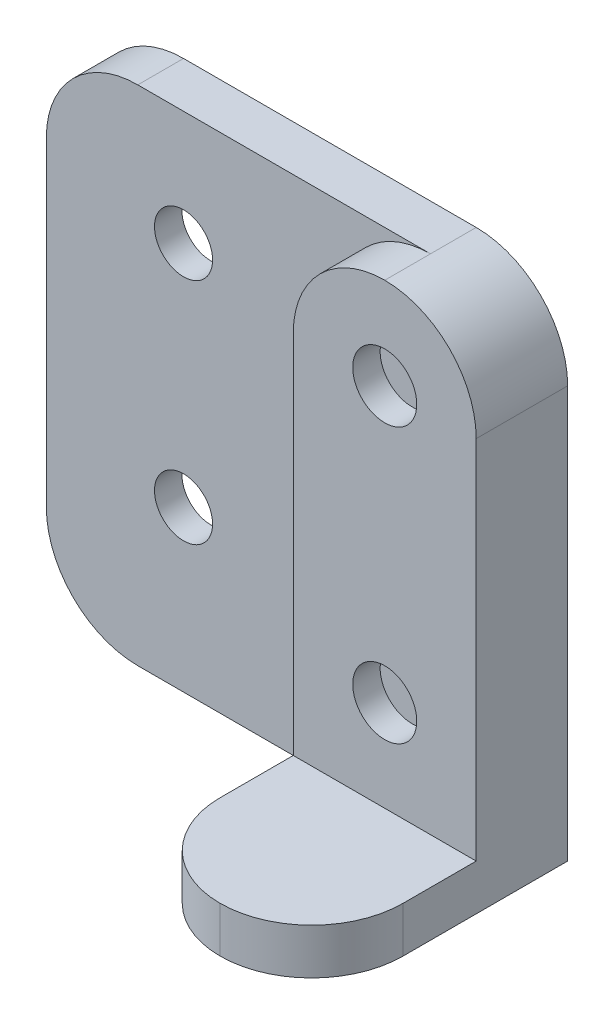
ISO-10303-21;
HEADER;
FILE_DESCRIPTION(('STEP AP214'),'2;1');
FILE_NAME('part.step','',(''),(''),'','','');
FILE_SCHEMA(('AUTOMOTIVE_DESIGN { 1 0 10303 214 1 1 1 1 }'));
ENDSEC;
DATA;
#1=APPLICATION_CONTEXT('core data for automotive mechanical design processes');
#2=APPLICATION_PROTOCOL_DEFINITION('international standard','automotive_design',2000,#1);
#3=PRODUCT_CONTEXT('',#1,'mechanical');
#4=PRODUCT('Part','Part','',(#3));
#5=PRODUCT_RELATED_PRODUCT_CATEGORY('part','',(#4));
#6=PRODUCT_DEFINITION_FORMATION('','',#4);
#7=PRODUCT_DEFINITION_CONTEXT('part definition',#1,'design');
#8=PRODUCT_DEFINITION('design','',#6,#7);
#9=PRODUCT_DEFINITION_SHAPE('','',#8);
#10=(LENGTH_UNIT() NAMED_UNIT(*) SI_UNIT(.MILLI.,.METRE.));
#11=(NAMED_UNIT(*) PLANE_ANGLE_UNIT() SI_UNIT($,.RADIAN.));
#12=(NAMED_UNIT(*) SI_UNIT($,.STERADIAN.) SOLID_ANGLE_UNIT());
#13=UNCERTAINTY_MEASURE_WITH_UNIT(LENGTH_MEASURE(1.E-05),#10,'distance_accuracy_value','');
#14=(GEOMETRIC_REPRESENTATION_CONTEXT(3) GLOBAL_UNCERTAINTY_ASSIGNED_CONTEXT((#13)) GLOBAL_UNIT_ASSIGNED_CONTEXT((#10,
#11,#12)) REPRESENTATION_CONTEXT('',''));
#15=CARTESIAN_POINT('',(0.,0.,0.));
#16=DIRECTION('',(0.,0.,1.));
#17=DIRECTION('',(1.,0.,0.));
#18=AXIS2_PLACEMENT_3D('',#15,#16,#17);
#19=CARTESIAN_POINT('',(0.,-12.5,0.));
#20=DIRECTION('',(0.,0.,1.));
#21=DIRECTION('',(1.,0.,0.));
#22=AXIS2_PLACEMENT_3D('',#19,#20,#21);
#23=CYLINDRICAL_SURFACE('',#22,3.175);
#24=CARTESIAN_POINT('',(0.,-12.5,5.));
#25=DIRECTION('',(0.,0.,1.));
#26=DIRECTION('',(1.,0.,0.));
#27=AXIS2_PLACEMENT_3D('',#24,#25,#26);
#28=CIRCLE('',#27,3.175);
#29=CARTESIAN_POINT('',(3.175,-12.5,5.));
#30=VERTEX_POINT('',#29);
#31=EDGE_CURVE('E198',#30,#30,#28,.T.);
#32=ORIENTED_EDGE('',*,*,#31,.T.);
#33=EDGE_LOOP('',(#32));
#34=FACE_BOUND('',#33,.T.);
#35=CARTESIAN_POINT('',(0.,-12.5,2.));
#36=DIRECTION('',(0.,0.,-1.));
#37=DIRECTION('',(-1.,0.,0.));
#38=AXIS2_PLACEMENT_3D('',#35,#36,#37);
#39=CIRCLE('',#38,3.175);
#40=CARTESIAN_POINT('',(-3.175,-12.5,2.));
#41=VERTEX_POINT('',#40);
#42=EDGE_CURVE('E189',#41,#41,#39,.F.);
#43=ORIENTED_EDGE('',*,*,#42,.F.);
#44=EDGE_LOOP('',(#43));
#45=FACE_BOUND('',#44,.T.);
#46=ADVANCED_FACE('F35',(#34,#45),#23,.F.);
#47=CARTESIAN_POINT('',(0.,12.5,0.));
#48=DIRECTION('',(0.,0.,1.));
#49=DIRECTION('',(1.,0.,0.));
#50=AXIS2_PLACEMENT_3D('',#47,#48,#49);
#51=CYLINDRICAL_SURFACE('',#50,3.175);
#52=CARTESIAN_POINT('',(0.,12.5,5.));
#53=DIRECTION('',(0.,0.,1.));
#54=DIRECTION('',(1.,0.,0.));
#55=AXIS2_PLACEMENT_3D('',#52,#53,#54);
#56=CIRCLE('',#55,3.175);
#57=CARTESIAN_POINT('',(3.17499999999999,12.5,5.));
#58=VERTEX_POINT('',#57);
#59=EDGE_CURVE('E199',#58,#58,#56,.T.);
#60=ORIENTED_EDGE('',*,*,#59,.T.);
#61=EDGE_LOOP('',(#60));
#62=FACE_BOUND('',#61,.T.);
#63=CARTESIAN_POINT('',(0.,12.5,2.));
#64=DIRECTION('',(0.,0.,-1.));
#65=DIRECTION('',(-1.,0.,0.));
#66=AXIS2_PLACEMENT_3D('',#63,#64,#65);
#67=CIRCLE('',#66,3.175);
#68=CARTESIAN_POINT('',(-3.175,12.5,2.));
#69=VERTEX_POINT('',#68);
#70=EDGE_CURVE('E169',#69,#69,#67,.F.);
#71=ORIENTED_EDGE('',*,*,#70,.F.);
#72=EDGE_LOOP('',(#71));
#73=FACE_BOUND('',#72,.T.);
#74=ADVANCED_FACE('F315',(#62,#73),#51,.F.);
#75=CARTESIAN_POINT('',(-15.,25.,5.));
#76=DIRECTION('',(0.,-1.,0.));
#77=DIRECTION('',(0.,0.,-1.));
#78=AXIS2_PLACEMENT_3D('',#75,#76,#77);
#79=PLANE('',#78);
#80=DIRECTION('',(-1.,0.,0.));
#81=VECTOR('',#80,1.);
#82=CARTESIAN_POINT('',(-15.,25.,0.));
#83=LINE('',#82,#81);
#84=CARTESIAN_POINT('',(27.,25.,0.));
#85=VERTEX_POINT('',#84);
#86=CARTESIAN_POINT('',(-5.,25.,0.));
#87=VERTEX_POINT('',#86);
#88=EDGE_CURVE('E202',#85,#87,#83,.T.);
#89=ORIENTED_EDGE('',*,*,#88,.T.);
#90=DIRECTION('',(0.,0.,-1.));
#91=VECTOR('',#90,1.);
#92=CARTESIAN_POINT('',(-5.,25.,5.));
#93=LINE('',#92,#91);
#94=CARTESIAN_POINT('',(-5.,25.,5.));
#95=VERTEX_POINT('',#94);
#96=EDGE_CURVE('E232',#87,#95,#93,.F.);
#97=ORIENTED_EDGE('',*,*,#96,.T.);
#98=DIRECTION('',(-1.,0.,0.));
#99=VECTOR('',#98,1.);
#100=CARTESIAN_POINT('',(-15.,25.,5.));
#101=LINE('',#100,#99);
#102=CARTESIAN_POINT('',(27.,25.,5.));
#103=VERTEX_POINT('',#102);
#104=EDGE_CURVE('E205',#103,#95,#101,.T.);
#105=ORIENTED_EDGE('',*,*,#104,.F.);
#106=DIRECTION('',(0.,0.,1.));
#107=VECTOR('',#106,1.);
#108=CARTESIAN_POINT('',(27.,25.,5.));
#109=LINE('',#108,#107);
#110=EDGE_CURVE('E230',#103,#85,#109,.F.);
#111=ORIENTED_EDGE('',*,*,#110,.T.);
#112=EDGE_LOOP('',(#89,#97,#105,#111));
#113=FACE_BOUND('',#112,.T.);
#114=ADVANCED_FACE('F292',(#113),#79,.F.);
#115=CARTESIAN_POINT('',(-15.,-25.,5.));
#116=DIRECTION('',(1.,0.,0.));
#117=DIRECTION('',(0.,0.,-1.));
#118=AXIS2_PLACEMENT_3D('',#115,#116,#117);
#119=PLANE('',#118);
#120=DIRECTION('',(0.,-1.,0.));
#121=VECTOR('',#120,1.);
#122=CARTESIAN_POINT('',(-15.,-25.,0.));
#123=LINE('',#122,#121);
#124=CARTESIAN_POINT('',(-15.,15.,0.));
#125=VERTEX_POINT('',#124);
#126=CARTESIAN_POINT('',(-15.,-20.,0.));
#127=VERTEX_POINT('',#126);
#128=EDGE_CURVE('E209',#125,#127,#123,.T.);
#129=ORIENTED_EDGE('',*,*,#128,.T.);
#130=DIRECTION('',(0.,0.,-1.));
#131=VECTOR('',#130,1.);
#132=CARTESIAN_POINT('',(-15.,-20.,5.));
#133=LINE('',#132,#131);
#134=CARTESIAN_POINT('',(-15.,-20.,5.));
#135=VERTEX_POINT('',#134);
#136=EDGE_CURVE('E247',#127,#135,#133,.F.);
#137=ORIENTED_EDGE('',*,*,#136,.T.);
#138=DIRECTION('',(0.,-1.,0.));
#139=VECTOR('',#138,1.);
#140=CARTESIAN_POINT('',(-15.,-25.,5.));
#141=LINE('',#140,#139);
#142=CARTESIAN_POINT('',(-15.,15.,5.));
#143=VERTEX_POINT('',#142);
#144=EDGE_CURVE('E208',#143,#135,#141,.T.);
#145=ORIENTED_EDGE('',*,*,#144,.F.);
#146=DIRECTION('',(0.,0.,-1.));
#147=VECTOR('',#146,1.);
#148=CARTESIAN_POINT('',(-15.,15.,5.));
#149=LINE('',#148,#147);
#150=EDGE_CURVE('E244',#143,#125,#149,.T.);
#151=ORIENTED_EDGE('',*,*,#150,.T.);
#152=EDGE_LOOP('',(#129,#137,#145,#151));
#153=FACE_BOUND('',#152,.T.);
#154=ADVANCED_FACE('F284',(#153),#119,.F.);
#155=CARTESIAN_POINT('',(0.,0.,5.));
#156=DIRECTION('',(0.,0.,-1.));
#157=DIRECTION('',(-1.,0.,0.));
#158=AXIS2_PLACEMENT_3D('',#155,#156,#157);
#159=PLANE('',#158);
#160=ORIENTED_EDGE('',*,*,#59,.F.);
#161=EDGE_LOOP('',(#160));
#162=FACE_BOUND('',#161,.T.);
#163=ORIENTED_EDGE('',*,*,#31,.F.);
#164=EDGE_LOOP('',(#163));
#165=FACE_BOUND('',#164,.T.);
#166=ORIENTED_EDGE('',*,*,#144,.T.);
#167=CARTESIAN_POINT('',(-5.,-20.,5.));
#168=DIRECTION('',(0.,0.,-1.));
#169=DIRECTION('',(-1.,0.,0.));
#170=AXIS2_PLACEMENT_3D('',#167,#168,#169);
#171=CIRCLE('',#170,10.);
#172=CARTESIAN_POINT('',(-5.,-30.,5.));
#173=VERTEX_POINT('',#172);
#174=EDGE_CURVE('E251',#135,#173,#171,.F.);
#175=ORIENTED_EDGE('',*,*,#174,.T.);
#176=DIRECTION('',(-1.,0.,0.));
#177=VECTOR('',#176,1.);
#178=CARTESIAN_POINT('',(0.,-30.,5.));
#179=LINE('',#178,#177);
#180=CARTESIAN_POINT('',(17.,-30.,5.));
#181=VERTEX_POINT('',#180);
#182=EDGE_CURVE('E157',#181,#173,#179,.T.);
#183=ORIENTED_EDGE('',*,*,#182,.F.);
#184=DIRECTION('',(0.,-1.,0.));
#185=VECTOR('',#184,1.);
#186=CARTESIAN_POINT('',(17.,25.,5.));
#187=LINE('',#186,#185);
#188=CARTESIAN_POINT('',(17.,15.,5.));
#189=VERTEX_POINT('',#188);
#190=EDGE_CURVE('E196',#189,#181,#187,.T.);
#191=ORIENTED_EDGE('',*,*,#190,.F.);
#192=CARTESIAN_POINT('',(27.,15.,5.));
#193=DIRECTION('',(0.,0.,-1.));
#194=DIRECTION('',(-1.,0.,0.));
#195=AXIS2_PLACEMENT_3D('',#192,#193,#194);
#196=CIRCLE('',#195,10.);
#197=EDGE_CURVE('E11',#189,#103,#196,.T.);
#198=ORIENTED_EDGE('',*,*,#197,.T.);
#199=ORIENTED_EDGE('',*,*,#104,.T.);
#200=CARTESIAN_POINT('',(-5.,15.,5.));
#201=DIRECTION('',(0.,0.,-1.));
#202=DIRECTION('',(-1.,0.,0.));
#203=AXIS2_PLACEMENT_3D('',#200,#201,#202);
#204=CIRCLE('',#203,10.);
#205=EDGE_CURVE('E249',#95,#143,#204,.F.);
#206=ORIENTED_EDGE('',*,*,#205,.T.);
#207=EDGE_LOOP('',(#166,#175,#183,#191,#198,#199,#206));
#208=FACE_BOUND('',#207,.T.);
#209=ADVANCED_FACE('F277',(#162,#165,#208),#159,.F.);
#210=CARTESIAN_POINT('',(0.,0.,0.));
#211=DIRECTION('',(0.,0.,-1.));
#212=DIRECTION('',(-1.,0.,0.));
#213=AXIS2_PLACEMENT_3D('',#210,#211,#212);
#214=PLANE('',#213);
#215=CARTESIAN_POINT('',(0.,12.5,0.));
#216=DIRECTION('',(0.,0.,-1.));
#217=DIRECTION('',(-1.,0.,0.));
#218=AXIS2_PLACEMENT_3D('',#215,#216,#217);
#219=CIRCLE('',#218,9.);
#220=CARTESIAN_POINT('',(-9.00000000000001,12.5,0.));
#221=VERTEX_POINT('',#220);
#222=EDGE_CURVE('E170',#221,#221,#219,.T.);
#223=ORIENTED_EDGE('',*,*,#222,.F.);
#224=EDGE_LOOP('',(#223));
#225=FACE_BOUND('',#224,.T.);
#226=CARTESIAN_POINT('',(0.,-12.5,0.));
#227=DIRECTION('',(0.,0.,-1.));
#228=DIRECTION('',(-1.,0.,0.));
#229=AXIS2_PLACEMENT_3D('',#226,#227,#228);
#230=CIRCLE('',#229,9.);
#231=CARTESIAN_POINT('',(-9.,-12.5,0.));
#232=VERTEX_POINT('',#231);
#233=EDGE_CURVE('E161',#232,#232,#230,.T.);
#234=ORIENTED_EDGE('',*,*,#233,.F.);
#235=EDGE_LOOP('',(#234));
#236=FACE_BOUND('',#235,.T.);
#237=DIRECTION('',(1.,0.,0.));
#238=VECTOR('',#237,1.);
#239=CARTESIAN_POINT('',(0.,-30.,0.));
#240=LINE('',#239,#238);
#241=CARTESIAN_POINT('',(-5.,-30.,0.));
#242=VERTEX_POINT('',#241);
#243=CARTESIAN_POINT('',(37.,-30.,0.));
#244=VERTEX_POINT('',#243);
#245=EDGE_CURVE('E128',#242,#244,#240,.T.);
#246=ORIENTED_EDGE('',*,*,#245,.F.);
#247=CARTESIAN_POINT('',(-5.,-20.,0.));
#248=DIRECTION('',(0.,0.,-1.));
#249=DIRECTION('',(-1.,0.,0.));
#250=AXIS2_PLACEMENT_3D('',#247,#248,#249);
#251=CIRCLE('',#250,10.);
#252=EDGE_CURVE('E242',#242,#127,#251,.T.);
#253=ORIENTED_EDGE('',*,*,#252,.T.);
#254=ORIENTED_EDGE('',*,*,#128,.F.);
#255=CARTESIAN_POINT('',(-5.,15.,0.));
#256=DIRECTION('',(0.,0.,-1.));
#257=DIRECTION('',(-1.,0.,0.));
#258=AXIS2_PLACEMENT_3D('',#255,#256,#257);
#259=CIRCLE('',#258,10.);
#260=EDGE_CURVE('E240',#125,#87,#259,.T.);
#261=ORIENTED_EDGE('',*,*,#260,.T.);
#262=ORIENTED_EDGE('',*,*,#88,.F.);
#263=CARTESIAN_POINT('',(27.,15.,0.));
#264=DIRECTION('',(0.,0.,-1.));
#265=DIRECTION('',(-1.,0.,0.));
#266=AXIS2_PLACEMENT_3D('',#263,#264,#265);
#267=CIRCLE('',#266,10.);
#268=CARTESIAN_POINT('',(37.,15.,0.));
#269=VERTEX_POINT('',#268);
#270=EDGE_CURVE('E145',#85,#269,#267,.T.);
#271=ORIENTED_EDGE('',*,*,#270,.T.);
#272=DIRECTION('',(0.,1.,0.));
#273=VECTOR('',#272,1.);
#274=CARTESIAN_POINT('',(37.,25.,0.));
#275=LINE('',#274,#273);
#276=EDGE_CURVE('E141',#244,#269,#275,.T.);
#277=ORIENTED_EDGE('',*,*,#276,.F.);
#278=EDGE_LOOP('',(#246,#253,#254,#261,#262,#271,#277));
#279=FACE_BOUND('',#278,.T.);
#280=ADVANCED_FACE('F142',(#225,#236,#279),#214,.T.);
#281=CARTESIAN_POINT('',(37.,25.,10.));
#282=DIRECTION('',(0.,0.,-1.));
#283=DIRECTION('',(0.,1.,0.));
#284=AXIS2_PLACEMENT_3D('',#281,#282,#283);
#285=PLANE('',#284);
#286=CARTESIAN_POINT('',(27.,15.,10.));
#287=DIRECTION('',(0.,0.,1.));
#288=DIRECTION('',(1.,0.,0.));
#289=AXIS2_PLACEMENT_3D('',#286,#287,#288);
#290=CIRCLE('',#289,3.5);
#291=CARTESIAN_POINT('',(30.5,15.,10.));
#292=VERTEX_POINT('',#291);
#293=EDGE_CURVE('E181',#292,#292,#290,.T.);
#294=ORIENTED_EDGE('',*,*,#293,.F.);
#295=EDGE_LOOP('',(#294));
#296=FACE_BOUND('',#295,.T.);
#297=CARTESIAN_POINT('',(27.,-15.,10.));
#298=DIRECTION('',(0.,0.,1.));
#299=DIRECTION('',(1.,0.,0.));
#300=AXIS2_PLACEMENT_3D('',#297,#298,#299);
#301=CIRCLE('',#300,3.5);
#302=CARTESIAN_POINT('',(30.5,-15.,10.));
#303=VERTEX_POINT('',#302);
#304=EDGE_CURVE('E187',#303,#303,#301,.T.);
#305=ORIENTED_EDGE('',*,*,#304,.F.);
#306=EDGE_LOOP('',(#305));
#307=FACE_BOUND('',#306,.T.);
#308=CARTESIAN_POINT('',(27.,15.,10.));
#309=DIRECTION('',(0.,0.,-1.));
#310=DIRECTION('',(0.,1.,0.));
#311=AXIS2_PLACEMENT_3D('',#308,#309,#310);
#312=CIRCLE('',#311,10.);
#313=CARTESIAN_POINT('',(37.,15.,10.));
#314=VERTEX_POINT('',#313);
#315=CARTESIAN_POINT('',(27.,25.,10.));
#316=VERTEX_POINT('',#315);
#317=EDGE_CURVE('E212',#314,#316,#312,.F.);
#318=ORIENTED_EDGE('',*,*,#317,.T.);
#319=CARTESIAN_POINT('',(27.,15.,10.));
#320=DIRECTION('',(0.,0.,-1.));
#321=DIRECTION('',(0.,1.,0.));
#322=AXIS2_PLACEMENT_3D('',#319,#320,#321);
#323=CIRCLE('',#322,10.);
#324=CARTESIAN_POINT('',(17.,15.,10.));
#325=VERTEX_POINT('',#324);
#326=EDGE_CURVE('E222',#316,#325,#323,.F.);
#327=ORIENTED_EDGE('',*,*,#326,.T.);
#328=DIRECTION('',(0.,-1.,0.));
#329=VECTOR('',#328,1.);
#330=CARTESIAN_POINT('',(17.,25.,10.));
#331=LINE('',#330,#329);
#332=CARTESIAN_POINT('',(17.,-25.,9.99999999999999));
#333=VERTEX_POINT('',#332);
#334=EDGE_CURVE('E149',#325,#333,#331,.T.);
#335=ORIENTED_EDGE('',*,*,#334,.T.);
#336=DIRECTION('',(-1.,0.,0.));
#337=VECTOR('',#336,1.);
#338=CARTESIAN_POINT('',(37.,-25.,9.99999999999999));
#339=LINE('',#338,#337);
#340=CARTESIAN_POINT('',(37.,-25.,9.99999999999999));
#341=VERTEX_POINT('',#340);
#342=EDGE_CURVE('E192',#341,#333,#339,.T.);
#343=ORIENTED_EDGE('',*,*,#342,.F.);
#344=DIRECTION('',(0.,-1.,0.));
#345=VECTOR('',#344,1.);
#346=CARTESIAN_POINT('',(37.,25.,10.));
#347=LINE('',#346,#345);
#348=EDGE_CURVE('E148',#314,#341,#347,.T.);
#349=ORIENTED_EDGE('',*,*,#348,.F.);
#350=EDGE_LOOP('',(#318,#327,#335,#343,#349));
#351=FACE_BOUND('',#350,.T.);
#352=ADVANCED_FACE('F300',(#296,#307,#351),#285,.F.);
#353=CARTESIAN_POINT('',(37.,0.,0.));
#354=DIRECTION('',(-1.,0.,0.));
#355=DIRECTION('',(0.,0.,1.));
#356=AXIS2_PLACEMENT_3D('',#353,#354,#355);
#357=PLANE('',#356);
#358=ORIENTED_EDGE('',*,*,#276,.T.);
#359=DIRECTION('',(0.,0.,1.));
#360=VECTOR('',#359,1.);
#361=CARTESIAN_POINT('',(37.,15.,0.));
#362=LINE('',#361,#360);
#363=EDGE_CURVE('E254',#269,#314,#362,.T.);
#364=ORIENTED_EDGE('',*,*,#363,.T.);
#365=ORIENTED_EDGE('',*,*,#348,.T.);
#366=DIRECTION('',(0.,0.,1.));
#367=VECTOR('',#366,1.);
#368=CARTESIAN_POINT('',(37.,-25.,0.));
#369=LINE('',#368,#367);
#370=CARTESIAN_POINT('',(37.,-25.,18.));
#371=VERTEX_POINT('',#370);
#372=EDGE_CURVE('E162',#341,#371,#369,.T.);
#373=ORIENTED_EDGE('',*,*,#372,.T.);
#374=DIRECTION('',(0.,1.,0.));
#375=VECTOR('',#374,1.);
#376=CARTESIAN_POINT('',(37.,0.,18.));
#377=LINE('',#376,#375);
#378=CARTESIAN_POINT('',(37.,-30.,18.));
#379=VERTEX_POINT('',#378);
#380=EDGE_CURVE('E153',#371,#379,#377,.F.);
#381=ORIENTED_EDGE('',*,*,#380,.T.);
#382=DIRECTION('',(0.,0.,1.));
#383=VECTOR('',#382,1.);
#384=CARTESIAN_POINT('',(37.,-30.,0.));
#385=LINE('',#384,#383);
#386=EDGE_CURVE('E133',#244,#379,#385,.T.);
#387=ORIENTED_EDGE('',*,*,#386,.F.);
#388=EDGE_LOOP('',(#358,#364,#365,#373,#381,#387));
#389=FACE_BOUND('',#388,.T.);
#390=ADVANCED_FACE('F151',(#389),#357,.F.);
#391=CARTESIAN_POINT('',(17.,0.,0.));
#392=DIRECTION('',(-1.,0.,0.));
#393=DIRECTION('',(0.,0.,1.));
#394=AXIS2_PLACEMENT_3D('',#391,#392,#393);
#395=PLANE('',#394);
#396=ORIENTED_EDGE('',*,*,#334,.F.);
#397=DIRECTION('',(0.,0.,1.));
#398=VECTOR('',#397,1.);
#399=CARTESIAN_POINT('',(17.,15.,5.));
#400=LINE('',#399,#398);
#401=EDGE_CURVE('E227',#325,#189,#400,.F.);
#402=ORIENTED_EDGE('',*,*,#401,.T.);
#403=ORIENTED_EDGE('',*,*,#190,.T.);
#404=DIRECTION('',(0.,0.,1.));
#405=VECTOR('',#404,1.);
#406=CARTESIAN_POINT('',(17.,-30.,0.));
#407=LINE('',#406,#405);
#408=CARTESIAN_POINT('',(17.,-30.,18.));
#409=VERTEX_POINT('',#408);
#410=EDGE_CURVE('E154',#181,#409,#407,.T.);
#411=ORIENTED_EDGE('',*,*,#410,.T.);
#412=DIRECTION('',(0.,1.,0.));
#413=VECTOR('',#412,1.);
#414=CARTESIAN_POINT('',(17.,-25.,18.));
#415=LINE('',#414,#413);
#416=CARTESIAN_POINT('',(17.,-25.,18.));
#417=VERTEX_POINT('',#416);
#418=EDGE_CURVE('E224',#409,#417,#415,.T.);
#419=ORIENTED_EDGE('',*,*,#418,.T.);
#420=DIRECTION('',(0.,0.,1.));
#421=VECTOR('',#420,1.);
#422=CARTESIAN_POINT('',(17.,-25.,0.));
#423=LINE('',#422,#421);
#424=EDGE_CURVE('E138',#333,#417,#423,.T.);
#425=ORIENTED_EDGE('',*,*,#424,.F.);
#426=EDGE_LOOP('',(#396,#402,#403,#411,#419,#425));
#427=FACE_BOUND('',#426,.T.);
#428=ADVANCED_FACE('F271',(#427),#395,.T.);
#429=CARTESIAN_POINT('',(27.,-15.,7.));
#430=DIRECTION('',(0.,0.,1.));
#431=DIRECTION('',(1.,0.,0.));
#432=AXIS2_PLACEMENT_3D('',#429,#430,#431);
#433=CYLINDRICAL_SURFACE('',#432,3.5);
#434=CARTESIAN_POINT('',(27.,-15.,7.));
#435=DIRECTION('',(0.,0.,1.));
#436=DIRECTION('',(1.,0.,0.));
#437=AXIS2_PLACEMENT_3D('',#434,#435,#436);
#438=CIRCLE('',#437,3.5);
#439=CARTESIAN_POINT('',(30.5,-15.,7.));
#440=VERTEX_POINT('',#439);
#441=EDGE_CURVE('E184',#440,#440,#438,.T.);
#442=ORIENTED_EDGE('',*,*,#441,.F.);
#443=EDGE_LOOP('',(#442));
#444=FACE_BOUND('',#443,.T.);
#445=ORIENTED_EDGE('',*,*,#304,.T.);
#446=EDGE_LOOP('',(#445));
#447=FACE_BOUND('',#446,.T.);
#448=ADVANCED_FACE('F386',(#444,#447),#433,.F.);
#449=CARTESIAN_POINT('',(27.,-15.,7.));
#450=DIRECTION('',(0.,0.,1.));
#451=DIRECTION('',(1.,0.,0.));
#452=AXIS2_PLACEMENT_3D('',#449,#450,#451);
#453=PLANE('',#452);
#454=ORIENTED_EDGE('',*,*,#441,.T.);
#455=EDGE_LOOP('',(#454));
#456=FACE_BOUND('',#455,.T.);
#457=ADVANCED_FACE('F503',(#456),#453,.T.);
#458=CARTESIAN_POINT('',(27.,15.,7.));
#459=DIRECTION('',(0.,0.,1.));
#460=DIRECTION('',(1.,0.,0.));
#461=AXIS2_PLACEMENT_3D('',#458,#459,#460);
#462=CYLINDRICAL_SURFACE('',#461,3.5);
#463=CARTESIAN_POINT('',(27.,15.,7.));
#464=DIRECTION('',(0.,0.,1.));
#465=DIRECTION('',(1.,0.,0.));
#466=AXIS2_PLACEMENT_3D('',#463,#464,#465);
#467=CIRCLE('',#466,3.5);
#468=CARTESIAN_POINT('',(30.5,15.,7.));
#469=VERTEX_POINT('',#468);
#470=EDGE_CURVE('E178',#469,#469,#467,.T.);
#471=ORIENTED_EDGE('',*,*,#470,.F.);
#472=EDGE_LOOP('',(#471));
#473=FACE_BOUND('',#472,.T.);
#474=ORIENTED_EDGE('',*,*,#293,.T.);
#475=EDGE_LOOP('',(#474));
#476=FACE_BOUND('',#475,.T.);
#477=ADVANCED_FACE('F493',(#473,#476),#462,.F.);
#478=CARTESIAN_POINT('',(27.,15.,7.));
#479=DIRECTION('',(0.,0.,1.));
#480=DIRECTION('',(1.,0.,0.));
#481=AXIS2_PLACEMENT_3D('',#478,#479,#480);
#482=PLANE('',#481);
#483=ORIENTED_EDGE('',*,*,#470,.T.);
#484=EDGE_LOOP('',(#483));
#485=FACE_BOUND('',#484,.T.);
#486=ADVANCED_FACE('F474',(#485),#482,.T.);
#487=CARTESIAN_POINT('',(0.,12.5,2.));
#488=DIRECTION('',(0.,0.,-1.));
#489=DIRECTION('',(-1.,0.,0.));
#490=AXIS2_PLACEMENT_3D('',#487,#488,#489);
#491=PLANE('',#490);
#492=CARTESIAN_POINT('',(0.,12.5,2.));
#493=DIRECTION('',(0.,0.,-1.));
#494=DIRECTION('',(-1.,0.,0.));
#495=AXIS2_PLACEMENT_3D('',#492,#493,#494);
#496=CIRCLE('',#495,9.);
#497=CARTESIAN_POINT('',(-9.00000000000001,12.5,2.));
#498=VERTEX_POINT('',#497);
#499=EDGE_CURVE('E166',#498,#498,#496,.T.);
#500=ORIENTED_EDGE('',*,*,#499,.T.);
#501=EDGE_LOOP('',(#500));
#502=FACE_BOUND('',#501,.T.);
#503=ORIENTED_EDGE('',*,*,#70,.T.);
#504=EDGE_LOOP('',(#503));
#505=FACE_BOUND('',#504,.T.);
#506=ADVANCED_FACE('F464',(#502,#505),#491,.T.);
#507=CARTESIAN_POINT('',(0.,12.5,2.));
#508=DIRECTION('',(0.,0.,-1.));
#509=DIRECTION('',(-1.,0.,0.));
#510=AXIS2_PLACEMENT_3D('',#507,#508,#509);
#511=CYLINDRICAL_SURFACE('',#510,9.);
#512=ORIENTED_EDGE('',*,*,#499,.F.);
#513=EDGE_LOOP('',(#512));
#514=FACE_BOUND('',#513,.T.);
#515=ORIENTED_EDGE('',*,*,#222,.T.);
#516=EDGE_LOOP('',(#515));
#517=FACE_BOUND('',#516,.T.);
#518=ADVANCED_FACE('F454',(#514,#517),#511,.F.);
#519=CARTESIAN_POINT('',(0.,-12.5,2.));
#520=DIRECTION('',(0.,0.,-1.));
#521=DIRECTION('',(-1.,0.,0.));
#522=AXIS2_PLACEMENT_3D('',#519,#520,#521);
#523=PLANE('',#522);
#524=CARTESIAN_POINT('',(0.,-12.5,2.));
#525=DIRECTION('',(0.,0.,-1.));
#526=DIRECTION('',(-1.,0.,0.));
#527=AXIS2_PLACEMENT_3D('',#524,#525,#526);
#528=CIRCLE('',#527,9.);
#529=CARTESIAN_POINT('',(-9.,-12.5,2.));
#530=VERTEX_POINT('',#529);
#531=EDGE_CURVE('E173',#530,#530,#528,.T.);
#532=ORIENTED_EDGE('',*,*,#531,.T.);
#533=EDGE_LOOP('',(#532));
#534=FACE_BOUND('',#533,.T.);
#535=ORIENTED_EDGE('',*,*,#42,.T.);
#536=EDGE_LOOP('',(#535));
#537=FACE_BOUND('',#536,.T.);
#538=ADVANCED_FACE('F310',(#534,#537),#523,.T.);
#539=CARTESIAN_POINT('',(0.,-12.5,2.));
#540=DIRECTION('',(0.,0.,-1.));
#541=DIRECTION('',(-1.,0.,0.));
#542=AXIS2_PLACEMENT_3D('',#539,#540,#541);
#543=CYLINDRICAL_SURFACE('',#542,9.);
#544=ORIENTED_EDGE('',*,*,#531,.F.);
#545=EDGE_LOOP('',(#544));
#546=FACE_BOUND('',#545,.T.);
#547=ORIENTED_EDGE('',*,*,#233,.T.);
#548=EDGE_LOOP('',(#547));
#549=FACE_BOUND('',#548,.T.);
#550=ADVANCED_FACE('F303',(#546,#549),#543,.F.);
#551=CARTESIAN_POINT('',(0.,-25.,0.));
#552=DIRECTION('',(0.,-1.,0.));
#553=DIRECTION('',(0.,0.,-1.));
#554=AXIS2_PLACEMENT_3D('',#551,#552,#553);
#555=PLANE('',#554);
#556=ORIENTED_EDGE('',*,*,#424,.T.);
#557=CARTESIAN_POINT('',(27.,-25.,18.));
#558=DIRECTION('',(0.,-1.,0.));
#559=DIRECTION('',(0.,0.,-1.));
#560=AXIS2_PLACEMENT_3D('',#557,#558,#559);
#561=CIRCLE('',#560,10.);
#562=CARTESIAN_POINT('',(27.,-25.,28.));
#563=VERTEX_POINT('',#562);
#564=EDGE_CURVE('E44',#417,#563,#561,.F.);
#565=ORIENTED_EDGE('',*,*,#564,.T.);
#566=CARTESIAN_POINT('',(27.,-25.,18.));
#567=DIRECTION('',(0.,-1.,0.));
#568=DIRECTION('',(0.,0.,-1.));
#569=AXIS2_PLACEMENT_3D('',#566,#567,#568);
#570=CIRCLE('',#569,10.);
#571=EDGE_CURVE('E55',#563,#371,#570,.F.);
#572=ORIENTED_EDGE('',*,*,#571,.T.);
#573=ORIENTED_EDGE('',*,*,#372,.F.);
#574=ORIENTED_EDGE('',*,*,#342,.T.);
#575=EDGE_LOOP('',(#556,#565,#572,#573,#574));
#576=FACE_BOUND('',#575,.T.);
#577=ADVANCED_FACE('F301',(#576),#555,.F.);
#578=CARTESIAN_POINT('',(0.,-30.,0.));
#579=DIRECTION('',(0.,-1.,0.));
#580=DIRECTION('',(0.,0.,-1.));
#581=AXIS2_PLACEMENT_3D('',#578,#579,#580);
#582=PLANE('',#581);
#583=ORIENTED_EDGE('',*,*,#182,.T.);
#584=DIRECTION('',(0.,0.,-1.));
#585=VECTOR('',#584,1.);
#586=CARTESIAN_POINT('',(-5.,-30.,0.));
#587=LINE('',#586,#585);
#588=EDGE_CURVE('E136',#173,#242,#587,.T.);
#589=ORIENTED_EDGE('',*,*,#588,.T.);
#590=ORIENTED_EDGE('',*,*,#245,.T.);
#591=ORIENTED_EDGE('',*,*,#386,.T.);
#592=CARTESIAN_POINT('',(27.,-30.,18.));
#593=DIRECTION('',(0.,-1.,0.));
#594=DIRECTION('',(0.,0.,-1.));
#595=AXIS2_PLACEMENT_3D('',#592,#593,#594);
#596=CIRCLE('',#595,10.);
#597=CARTESIAN_POINT('',(27.,-30.,28.));
#598=VERTEX_POINT('',#597);
#599=EDGE_CURVE('E234',#379,#598,#596,.T.);
#600=ORIENTED_EDGE('',*,*,#599,.T.);
#601=CARTESIAN_POINT('',(27.,-30.,18.));
#602=DIRECTION('',(0.,-1.,0.));
#603=DIRECTION('',(0.,0.,-1.));
#604=AXIS2_PLACEMENT_3D('',#601,#602,#603);
#605=CIRCLE('',#604,10.);
#606=EDGE_CURVE('E236',#598,#409,#605,.T.);
#607=ORIENTED_EDGE('',*,*,#606,.T.);
#608=ORIENTED_EDGE('',*,*,#410,.F.);
#609=EDGE_LOOP('',(#583,#589,#590,#591,#600,#607,#608));
#610=FACE_BOUND('',#609,.T.);
#611=ADVANCED_FACE('F131',(#610),#582,.T.);
#612=CARTESIAN_POINT('',(27.,15.,0.));
#613=DIRECTION('',(0.,0.,1.));
#614=DIRECTION('',(1.,0.,0.));
#615=AXIS2_PLACEMENT_3D('',#612,#613,#614);
#616=CYLINDRICAL_SURFACE('',#615,10.);
#617=ORIENTED_EDGE('',*,*,#270,.F.);
#618=ORIENTED_EDGE('',*,*,#110,.F.);
#619=DIRECTION('',(0.,0.,1.));
#620=VECTOR('',#619,1.);
#621=CARTESIAN_POINT('',(27.,25.,5.));
#622=LINE('',#621,#620);
#623=EDGE_CURVE('E164',#316,#103,#622,.F.);
#624=ORIENTED_EDGE('',*,*,#623,.F.);
#625=ORIENTED_EDGE('',*,*,#317,.F.);
#626=ORIENTED_EDGE('',*,*,#363,.F.);
#627=EDGE_LOOP('',(#617,#618,#624,#625,#626));
#628=FACE_BOUND('',#627,.T.);
#629=ADVANCED_FACE('F295',(#628),#616,.T.);
#630=CARTESIAN_POINT('',(27.,15.,5.));
#631=DIRECTION('',(0.,0.,-1.));
#632=DIRECTION('',(-1.,0.,0.));
#633=AXIS2_PLACEMENT_3D('',#630,#631,#632);
#634=CYLINDRICAL_SURFACE('',#633,10.);
#635=ORIENTED_EDGE('',*,*,#197,.F.);
#636=ORIENTED_EDGE('',*,*,#401,.F.);
#637=ORIENTED_EDGE('',*,*,#326,.F.);
#638=ORIENTED_EDGE('',*,*,#623,.T.);
#639=EDGE_LOOP('',(#635,#636,#637,#638));
#640=FACE_BOUND('',#639,.T.);
#641=ADVANCED_FACE('F336',(#640),#634,.T.);
#642=CARTESIAN_POINT('',(-5.,-20.,0.));
#643=DIRECTION('',(0.,0.,1.));
#644=DIRECTION('',(1.,0.,0.));
#645=AXIS2_PLACEMENT_3D('',#642,#643,#644);
#646=CYLINDRICAL_SURFACE('',#645,10.);
#647=ORIENTED_EDGE('',*,*,#174,.F.);
#648=ORIENTED_EDGE('',*,*,#136,.F.);
#649=ORIENTED_EDGE('',*,*,#252,.F.);
#650=ORIENTED_EDGE('',*,*,#588,.F.);
#651=EDGE_LOOP('',(#647,#648,#649,#650));
#652=FACE_BOUND('',#651,.T.);
#653=ADVANCED_FACE('F280',(#652),#646,.T.);
#654=CARTESIAN_POINT('',(-5.,15.,5.));
#655=DIRECTION('',(0.,0.,-1.));
#656=DIRECTION('',(-1.,0.,0.));
#657=AXIS2_PLACEMENT_3D('',#654,#655,#656);
#658=CYLINDRICAL_SURFACE('',#657,10.);
#659=ORIENTED_EDGE('',*,*,#205,.F.);
#660=ORIENTED_EDGE('',*,*,#96,.F.);
#661=ORIENTED_EDGE('',*,*,#260,.F.);
#662=ORIENTED_EDGE('',*,*,#150,.F.);
#663=EDGE_LOOP('',(#659,#660,#661,#662));
#664=FACE_BOUND('',#663,.T.);
#665=ADVANCED_FACE('F289',(#664),#658,.T.);
#666=CARTESIAN_POINT('',(27.,-30.,18.));
#667=DIRECTION('',(0.,1.,0.));
#668=DIRECTION('',(0.,0.,1.));
#669=AXIS2_PLACEMENT_3D('',#666,#667,#668);
#670=CYLINDRICAL_SURFACE('',#669,10.);
#671=DIRECTION('',(0.,1.,0.));
#672=VECTOR('',#671,1.);
#673=CARTESIAN_POINT('',(27.,-30.,28.));
#674=LINE('',#673,#672);
#675=EDGE_CURVE('E39',#598,#563,#674,.T.);
#676=ORIENTED_EDGE('',*,*,#675,.F.);
#677=ORIENTED_EDGE('',*,*,#599,.F.);
#678=ORIENTED_EDGE('',*,*,#380,.F.);
#679=ORIENTED_EDGE('',*,*,#571,.F.);
#680=EDGE_LOOP('',(#676,#677,#678,#679));
#681=FACE_BOUND('',#680,.T.);
#682=ADVANCED_FACE('F37',(#681),#670,.T.);
#683=CARTESIAN_POINT('',(27.,0.,18.));
#684=DIRECTION('',(0.,-1.,0.));
#685=DIRECTION('',(0.,0.,-1.));
#686=AXIS2_PLACEMENT_3D('',#683,#684,#685);
#687=CYLINDRICAL_SURFACE('',#686,10.);
#688=ORIENTED_EDGE('',*,*,#606,.F.);
#689=ORIENTED_EDGE('',*,*,#675,.T.);
#690=ORIENTED_EDGE('',*,*,#564,.F.);
#691=ORIENTED_EDGE('',*,*,#418,.F.);
#692=EDGE_LOOP('',(#688,#689,#690,#691));
#693=FACE_BOUND('',#692,.T.);
#694=ADVANCED_FACE('F265',(#693),#687,.T.);
#695=CLOSED_SHELL('',(#46,#74,#114,#154,#209,#280,#352,#390,#428,#448,#457,#477,#486,#506,#518,
#538,#550,#577,#611,#629,#641,#653,#665,#682,#694));
#696=MANIFOLD_SOLID_BREP('B2',#695);
#697=ADVANCED_BREP_SHAPE_REPRESENTATION('',(#18,#696),#14);
#698=SHAPE_DEFINITION_REPRESENTATION(#9,#697);
ENDSEC;
END-ISO-10303-21;
